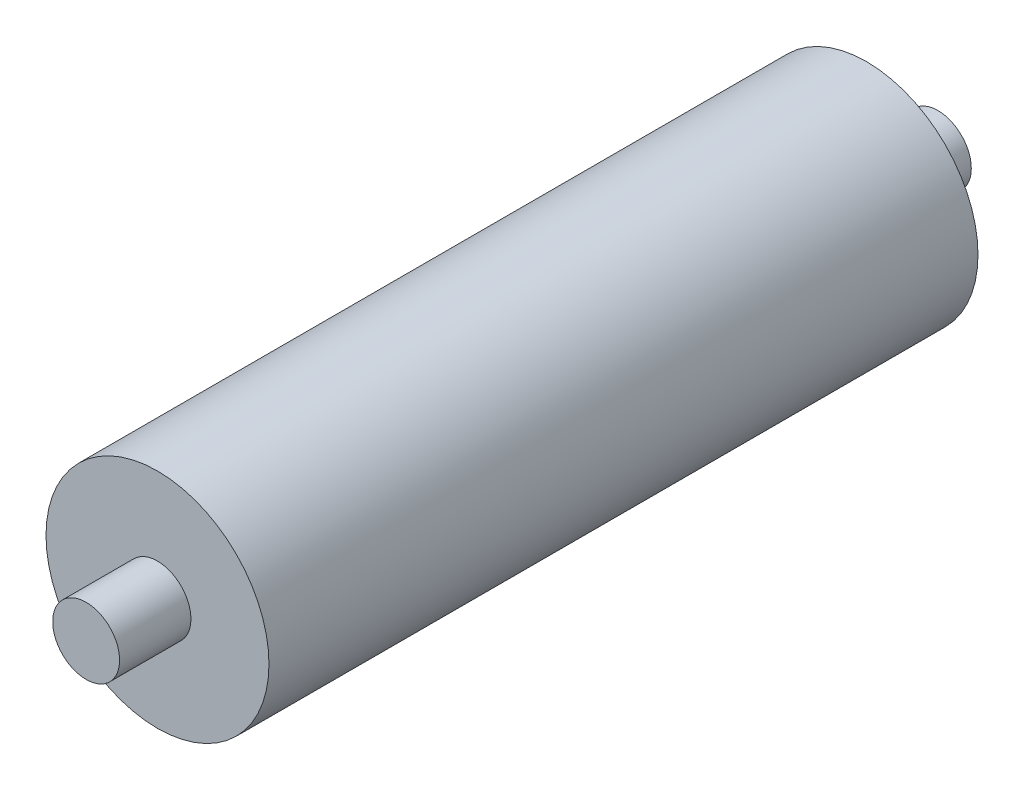
ISO-10303-21;
HEADER;
FILE_DESCRIPTION(('STEP AP214'),'2;1');
FILE_NAME('part.step','',(''),(''),'','','');
FILE_SCHEMA(('AUTOMOTIVE_DESIGN { 1 0 10303 214 1 1 1 1 }'));
ENDSEC;
DATA;
#1=APPLICATION_CONTEXT('core data for automotive mechanical design processes');
#2=APPLICATION_PROTOCOL_DEFINITION('international standard','automotive_design',2000,#1);
#3=PRODUCT_CONTEXT('',#1,'mechanical');
#4=PRODUCT('Part','Part','',(#3));
#5=PRODUCT_RELATED_PRODUCT_CATEGORY('part','',(#4));
#6=PRODUCT_DEFINITION_FORMATION('','',#4);
#7=PRODUCT_DEFINITION_CONTEXT('part definition',#1,'design');
#8=PRODUCT_DEFINITION('design','',#6,#7);
#9=PRODUCT_DEFINITION_SHAPE('','',#8);
#10=(LENGTH_UNIT() NAMED_UNIT(*) SI_UNIT(.MILLI.,.METRE.));
#11=(NAMED_UNIT(*) PLANE_ANGLE_UNIT() SI_UNIT($,.RADIAN.));
#12=(NAMED_UNIT(*) SI_UNIT($,.STERADIAN.) SOLID_ANGLE_UNIT());
#13=UNCERTAINTY_MEASURE_WITH_UNIT(LENGTH_MEASURE(1.E-05),#10,'distance_accuracy_value','');
#14=(GEOMETRIC_REPRESENTATION_CONTEXT(3) GLOBAL_UNCERTAINTY_ASSIGNED_CONTEXT((#13)) GLOBAL_UNIT_ASSIGNED_CONTEXT((#10,
#11,#12)) REPRESENTATION_CONTEXT('',''));
#15=CARTESIAN_POINT('',(0.,0.,0.));
#16=DIRECTION('',(0.,0.,1.));
#17=DIRECTION('',(1.,0.,0.));
#18=AXIS2_PLACEMENT_3D('',#15,#16,#17);
#19=CARTESIAN_POINT('',(-8.99395680568205,14.4897211555417,-318.));
#20=DIRECTION('',(0.,0.,1.));
#21=DIRECTION('',(1.,0.,0.));
#22=AXIS2_PLACEMENT_3D('',#19,#20,#21);
#23=CYLINDRICAL_SURFACE('',#22,50.);
#24=CARTESIAN_POINT('',(-8.99395680568205,14.4897211555417,-318.));
#25=DIRECTION('',(0.,0.,1.));
#26=DIRECTION('',(1.,0.,0.));
#27=AXIS2_PLACEMENT_3D('',#24,#25,#26);
#28=CIRCLE('',#27,50.);
#29=CARTESIAN_POINT('',(41.006043194318,14.4897211555417,-318.));
#30=VERTEX_POINT('',#29);
#31=EDGE_CURVE('E10',#30,#30,#28,.T.);
#32=CARTESIAN_POINT('',(-8.99395680568205,14.4897211555417,0.));
#33=DIRECTION('',(0.,0.,1.));
#34=DIRECTION('',(1.,0.,0.));
#35=AXIS2_PLACEMENT_3D('',#32,#33,#34);
#36=CIRCLE('',#35,50.);
#37=CARTESIAN_POINT('',(41.006043194318,14.4897211555417,0.));
#38=VERTEX_POINT('',#37);
#39=EDGE_CURVE('E34',#38,#38,#36,.T.);
#40=CARTESIAN_POINT('',(41.006043194318,14.4897211555417,-318.));
#41=CARTESIAN_POINT('',(41.006043194318,14.4897211555417,-314.6875));
#42=CARTESIAN_POINT('',(41.006043194318,14.4897211555417,-311.375));
#43=CARTESIAN_POINT('',(41.006043194318,14.4897211555417,-304.75));
#44=CARTESIAN_POINT('',(41.006043194318,14.4897211555417,-301.4375));
#45=CARTESIAN_POINT('',(41.006043194318,14.4897211555417,-294.8125));
#46=CARTESIAN_POINT('',(41.006043194318,14.4897211555417,-291.5));
#47=CARTESIAN_POINT('',(41.006043194318,14.4897211555417,-284.875));
#48=CARTESIAN_POINT('',(41.006043194318,14.4897211555417,-281.5625));
#49=CARTESIAN_POINT('',(41.006043194318,14.4897211555417,-274.9375));
#50=CARTESIAN_POINT('',(41.006043194318,14.4897211555417,-271.625));
#51=CARTESIAN_POINT('',(41.006043194318,14.4897211555417,-265.));
#52=CARTESIAN_POINT('',(41.006043194318,14.4897211555417,-261.6875));
#53=CARTESIAN_POINT('',(41.006043194318,14.4897211555417,-255.0625));
#54=CARTESIAN_POINT('',(41.006043194318,14.4897211555417,-251.75));
#55=CARTESIAN_POINT('',(41.006043194318,14.4897211555417,-245.125));
#56=CARTESIAN_POINT('',(41.006043194318,14.4897211555417,-241.8125));
#57=CARTESIAN_POINT('',(41.006043194318,14.4897211555417,-235.1875));
#58=CARTESIAN_POINT('',(41.006043194318,14.4897211555417,-231.875));
#59=CARTESIAN_POINT('',(41.006043194318,14.4897211555417,-225.25));
#60=CARTESIAN_POINT('',(41.006043194318,14.4897211555417,-221.9375));
#61=CARTESIAN_POINT('',(41.006043194318,14.4897211555417,-215.3125));
#62=CARTESIAN_POINT('',(41.006043194318,14.4897211555417,-212.));
#63=CARTESIAN_POINT('',(41.006043194318,14.4897211555417,-205.375));
#64=CARTESIAN_POINT('',(41.006043194318,14.4897211555417,-202.0625));
#65=CARTESIAN_POINT('',(41.006043194318,14.4897211555417,-195.4375));
#66=CARTESIAN_POINT('',(41.006043194318,14.4897211555417,-192.125));
#67=CARTESIAN_POINT('',(41.006043194318,14.4897211555417,-185.5));
#68=CARTESIAN_POINT('',(41.006043194318,14.4897211555417,-182.1875));
#69=CARTESIAN_POINT('',(41.006043194318,14.4897211555417,-175.5625));
#70=CARTESIAN_POINT('',(41.006043194318,14.4897211555417,-172.25));
#71=CARTESIAN_POINT('',(41.006043194318,14.4897211555417,-165.625));
#72=CARTESIAN_POINT('',(41.006043194318,14.4897211555417,-162.3125));
#73=CARTESIAN_POINT('',(41.006043194318,14.4897211555417,-155.6875));
#74=CARTESIAN_POINT('',(41.006043194318,14.4897211555417,-152.375));
#75=CARTESIAN_POINT('',(41.006043194318,14.4897211555417,-145.75));
#76=CARTESIAN_POINT('',(41.006043194318,14.4897211555417,-142.4375));
#77=CARTESIAN_POINT('',(41.006043194318,14.4897211555417,-135.8125));
#78=CARTESIAN_POINT('',(41.006043194318,14.4897211555417,-132.5));
#79=CARTESIAN_POINT('',(41.006043194318,14.4897211555417,-125.875));
#80=CARTESIAN_POINT('',(41.006043194318,14.4897211555417,-122.5625));
#81=CARTESIAN_POINT('',(41.006043194318,14.4897211555417,-115.9375));
#82=CARTESIAN_POINT('',(41.006043194318,14.4897211555417,-112.625));
#83=CARTESIAN_POINT('',(41.006043194318,14.4897211555417,-106.));
#84=CARTESIAN_POINT('',(41.006043194318,14.4897211555417,-102.6875));
#85=CARTESIAN_POINT('',(41.006043194318,14.4897211555417,-96.0625));
#86=CARTESIAN_POINT('',(41.006043194318,14.4897211555417,-92.75));
#87=CARTESIAN_POINT('',(41.006043194318,14.4897211555417,-86.125));
#88=CARTESIAN_POINT('',(41.006043194318,14.4897211555417,-82.8125));
#89=CARTESIAN_POINT('',(41.006043194318,14.4897211555417,-76.1875));
#90=CARTESIAN_POINT('',(41.006043194318,14.4897211555417,-72.875));
#91=CARTESIAN_POINT('',(41.006043194318,14.4897211555417,-66.25));
#92=CARTESIAN_POINT('',(41.006043194318,14.4897211555417,-62.9375));
#93=CARTESIAN_POINT('',(41.006043194318,14.4897211555417,-56.3125));
#94=CARTESIAN_POINT('',(41.006043194318,14.4897211555417,-53.));
#95=CARTESIAN_POINT('',(41.006043194318,14.4897211555417,-46.375));
#96=CARTESIAN_POINT('',(41.006043194318,14.4897211555417,-43.0625));
#97=CARTESIAN_POINT('',(41.006043194318,14.4897211555417,-36.4375));
#98=CARTESIAN_POINT('',(41.006043194318,14.4897211555417,-33.125));
#99=CARTESIAN_POINT('',(41.006043194318,14.4897211555417,-26.5));
#100=CARTESIAN_POINT('',(41.006043194318,14.4897211555417,-23.1875));
#101=CARTESIAN_POINT('',(41.006043194318,14.4897211555417,-16.5625));
#102=CARTESIAN_POINT('',(41.006043194318,14.4897211555417,-13.25));
#103=CARTESIAN_POINT('',(41.006043194318,14.4897211555417,-6.62499999999999));
#104=CARTESIAN_POINT('',(41.006043194318,14.4897211555417,-3.3125));
#105=CARTESIAN_POINT('',(41.006043194318,14.4897211555417,0.));
#106=B_SPLINE_CURVE_WITH_KNOTS('',3,(#40,#41,#42,#43,#44,#45,#46,#47,#48,#49,#50,#51,#52,#53,
#54,#55,#56,#57,#58,#59,#60,#61,#62,#63,#64,#65,#66,#67,#68,#69,#70,#71,#72,#73,#74,#75,#76,#77,
#78,#79,#80,#81,#82,#83,#84,#85,#86,#87,#88,#89,#90,#91,#92,#93,#94,#95,#96,#97,#98,#99,#100,
#101,#102,#103,#104,#105),.UNSPECIFIED.,.F.,.F.,(4,2,2,2,2,2,2,2,2,2,2,2,2,2,2,2,2,2,2,2,2,2,2,
2,2,2,2,2,2,2,2,2,4),(0.,9.93750000000004,19.875,29.8125,39.7500000000001,49.6875,59.625,
69.5625,79.5,89.4375000000001,99.375,109.3125,119.25,129.1875,139.125,149.0625,159.,168.9375,
178.875,188.8125,198.75,208.6875,218.625,228.5625,238.5,248.4375,258.375,268.3125,278.25,
288.1875,298.125,308.0625,318.),.UNSPECIFIED.);
#107=EDGE_CURVE('BSEAM31',#30,#38,#106,.T.);
#108=ORIENTED_EDGE('',*,*,#31,.T.);
#109=ORIENTED_EDGE('',*,*,#39,.F.);
#110=ORIENTED_EDGE('',*,*,#107,.T.);
#111=ORIENTED_EDGE('',*,*,#107,.F.);
#112=EDGE_LOOP('',(#108,#110,#109,#111));
#113=FACE_BOUND('',#112,.T.);
#114=ADVANCED_FACE('F31',(#113),#23,.T.);
#115=CARTESIAN_POINT('',(-8.99395680568205,14.4897211555417,-318.));
#116=DIRECTION('',(0.,0.,1.));
#117=DIRECTION('',(1.,0.,0.));
#118=AXIS2_PLACEMENT_3D('',#115,#116,#117);
#119=PLANE('',#118);
#120=CARTESIAN_POINT('',(-8.99395680568205,14.4897211555417,-318.));
#121=DIRECTION('',(0.,0.,1.));
#122=DIRECTION('',(1.,0.,0.));
#123=AXIS2_PLACEMENT_3D('',#120,#121,#122);
#124=CIRCLE('',#123,15.);
#125=CARTESIAN_POINT('',(6.00604319431795,14.4897211555417,-318.));
#126=VERTEX_POINT('',#125);
#127=EDGE_CURVE('E49',#126,#126,#124,.T.);
#128=ORIENTED_EDGE('',*,*,#127,.T.);
#129=EDGE_LOOP('',(#128));
#130=FACE_BOUND('',#129,.T.);
#131=ORIENTED_EDGE('',*,*,#31,.F.);
#132=EDGE_LOOP('',(#131));
#133=FACE_BOUND('',#132,.T.);
#134=ADVANCED_FACE('F67',(#130,#133),#119,.F.);
#135=CARTESIAN_POINT('',(-8.99395680568205,14.4897211555417,0.));
#136=DIRECTION('',(0.,0.,1.));
#137=DIRECTION('',(1.,0.,0.));
#138=AXIS2_PLACEMENT_3D('',#135,#136,#137);
#139=PLANE('',#138);
#140=CARTESIAN_POINT('',(-8.99395680568205,14.4897211555417,0.));
#141=DIRECTION('',(0.,0.,1.));
#142=DIRECTION('',(1.,0.,0.));
#143=AXIS2_PLACEMENT_3D('',#140,#141,#142);
#144=CIRCLE('',#143,15.);
#145=CARTESIAN_POINT('',(6.00604319431795,14.4897211555417,0.));
#146=VERTEX_POINT('',#145);
#147=EDGE_CURVE('E43',#146,#146,#144,.T.);
#148=ORIENTED_EDGE('',*,*,#147,.F.);
#149=EDGE_LOOP('',(#148));
#150=FACE_BOUND('',#149,.T.);
#151=ORIENTED_EDGE('',*,*,#39,.T.);
#152=EDGE_LOOP('',(#151));
#153=FACE_BOUND('',#152,.T.);
#154=ADVANCED_FACE('F71',(#150,#153),#139,.T.);
#155=CARTESIAN_POINT('',(-8.99395680568205,14.4897211555417,32.));
#156=DIRECTION('',(0.,0.,-1.));
#157=DIRECTION('',(-1.,0.,0.));
#158=AXIS2_PLACEMENT_3D('',#155,#156,#157);
#159=CYLINDRICAL_SURFACE('',#158,15.);
#160=CARTESIAN_POINT('',(-8.99395680568205,14.4897211555417,32.));
#161=DIRECTION('',(0.,0.,1.));
#162=DIRECTION('',(1.,0.,0.));
#163=AXIS2_PLACEMENT_3D('',#160,#161,#162);
#164=CIRCLE('',#163,15.);
#165=CARTESIAN_POINT('',(6.00604319431795,14.4897211555417,32.));
#166=VERTEX_POINT('',#165);
#167=EDGE_CURVE('E41',#166,#166,#164,.T.);
#168=ORIENTED_EDGE('',*,*,#167,.F.);
#169=EDGE_LOOP('',(#168));
#170=FACE_BOUND('',#169,.T.);
#171=ORIENTED_EDGE('',*,*,#147,.T.);
#172=EDGE_LOOP('',(#171));
#173=FACE_BOUND('',#172,.T.);
#174=ADVANCED_FACE('F78',(#170,#173),#159,.T.);
#175=CARTESIAN_POINT('',(-8.99395680568205,14.4897211555417,32.));
#176=DIRECTION('',(0.,0.,1.));
#177=DIRECTION('',(1.,0.,0.));
#178=AXIS2_PLACEMENT_3D('',#175,#176,#177);
#179=PLANE('',#178);
#180=ORIENTED_EDGE('',*,*,#167,.T.);
#181=EDGE_LOOP('',(#180));
#182=FACE_BOUND('',#181,.T.);
#183=ADVANCED_FACE('F64',(#182),#179,.T.);
#184=CARTESIAN_POINT('',(-8.99395680568205,14.4897211555417,-350.));
#185=DIRECTION('',(0.,0.,1.));
#186=DIRECTION('',(1.,0.,0.));
#187=AXIS2_PLACEMENT_3D('',#184,#185,#186);
#188=CYLINDRICAL_SURFACE('',#187,15.);
#189=CARTESIAN_POINT('',(-8.99395680568205,14.4897211555417,-350.));
#190=DIRECTION('',(0.,0.,1.));
#191=DIRECTION('',(1.,0.,0.));
#192=AXIS2_PLACEMENT_3D('',#189,#190,#191);
#193=CIRCLE('',#192,15.);
#194=CARTESIAN_POINT('',(6.00604319431795,14.4897211555417,-350.));
#195=VERTEX_POINT('',#194);
#196=EDGE_CURVE('E46',#195,#195,#193,.T.);
#197=ORIENTED_EDGE('',*,*,#196,.T.);
#198=EDGE_LOOP('',(#197));
#199=FACE_BOUND('',#198,.T.);
#200=ORIENTED_EDGE('',*,*,#127,.F.);
#201=EDGE_LOOP('',(#200));
#202=FACE_BOUND('',#201,.T.);
#203=ADVANCED_FACE('F55',(#199,#202),#188,.T.);
#204=CARTESIAN_POINT('',(-8.99395680568205,14.4897211555417,-350.));
#205=DIRECTION('',(0.,0.,-1.));
#206=DIRECTION('',(1.,0.,0.));
#207=AXIS2_PLACEMENT_3D('',#204,#205,#206);
#208=PLANE('',#207);
#209=ORIENTED_EDGE('',*,*,#196,.F.);
#210=EDGE_LOOP('',(#209));
#211=FACE_BOUND('',#210,.T.);
#212=ADVANCED_FACE('F58',(#211),#208,.T.);
#213=CLOSED_SHELL('',(#114,#134,#154,#174,#183,#203,#212));
#214=MANIFOLD_SOLID_BREP('B2',#213);
#215=ADVANCED_BREP_SHAPE_REPRESENTATION('',(#18,#214),#14);
#216=SHAPE_DEFINITION_REPRESENTATION(#9,#215);
ENDSEC;
END-ISO-10303-21;
